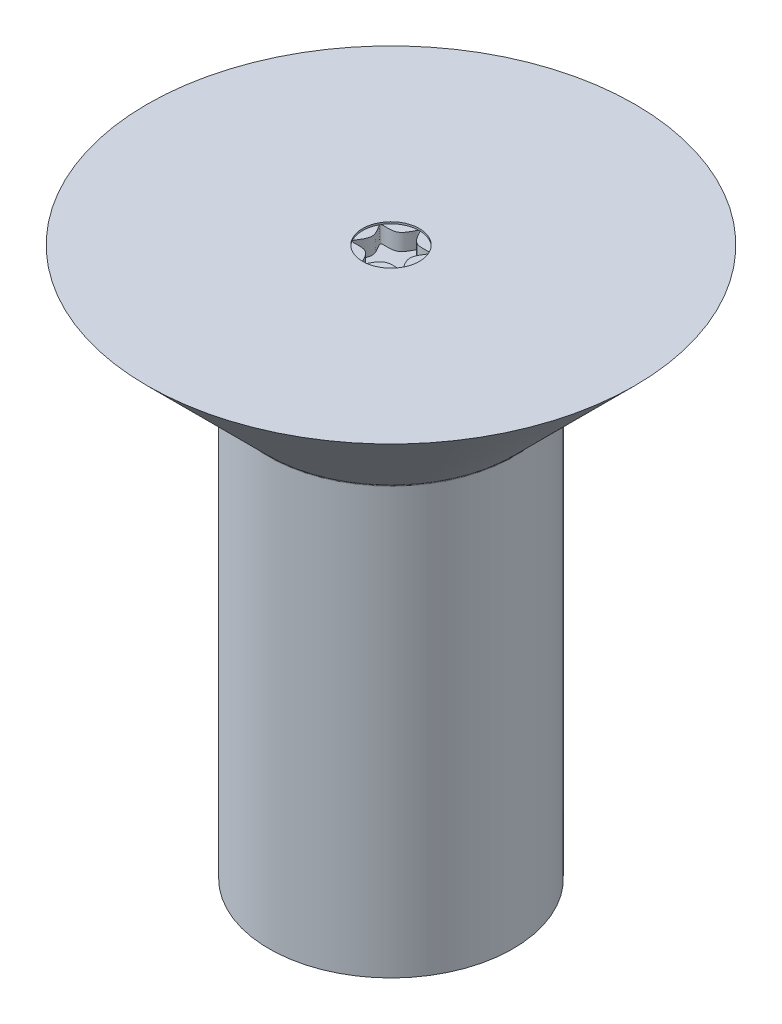
ISO-10303-21;
HEADER;
FILE_DESCRIPTION(('STEP AP214'),'2;1');
FILE_NAME('part.step','',(''),(''),'','','');
FILE_SCHEMA(('AUTOMOTIVE_DESIGN { 1 0 10303 214 1 1 1 1 }'));
ENDSEC;
DATA;
#1=APPLICATION_CONTEXT('core data for automotive mechanical design processes');
#2=APPLICATION_PROTOCOL_DEFINITION('international standard','automotive_design',2000,#1);
#3=PRODUCT_CONTEXT('',#1,'mechanical');
#4=PRODUCT('Part','Part','',(#3));
#5=PRODUCT_RELATED_PRODUCT_CATEGORY('part','',(#4));
#6=PRODUCT_DEFINITION_FORMATION('','',#4);
#7=PRODUCT_DEFINITION_CONTEXT('part definition',#1,'design');
#8=PRODUCT_DEFINITION('design','',#6,#7);
#9=PRODUCT_DEFINITION_SHAPE('','',#8);
#10=(LENGTH_UNIT() NAMED_UNIT(*) SI_UNIT(.MILLI.,.METRE.));
#11=(NAMED_UNIT(*) PLANE_ANGLE_UNIT() SI_UNIT($,.RADIAN.));
#12=(NAMED_UNIT(*) SI_UNIT($,.STERADIAN.) SOLID_ANGLE_UNIT());
#13=UNCERTAINTY_MEASURE_WITH_UNIT(LENGTH_MEASURE(1.E-05),#10,'distance_accuracy_value','');
#14=(GEOMETRIC_REPRESENTATION_CONTEXT(3) GLOBAL_UNCERTAINTY_ASSIGNED_CONTEXT((#13)) GLOBAL_UNIT_ASSIGNED_CONTEXT((#10,
#11,#12)) REPRESENTATION_CONTEXT('',''));
#15=CARTESIAN_POINT('',(0.,0.,0.));
#16=DIRECTION('',(0.,0.,1.));
#17=DIRECTION('',(1.,0.,0.));
#18=AXIS2_PLACEMENT_3D('',#15,#16,#17);
#19=CARTESIAN_POINT('',(0.,27.,0.));
#20=DIRECTION('',(0.,1.,0.));
#21=DIRECTION('',(0.,0.,1.));
#22=AXIS2_PLACEMENT_3D('',#19,#20,#21);
#23=PLANE('',#22);
#24=CARTESIAN_POINT('',(0.,27.,0.));
#25=DIRECTION('',(0.,1.,0.));
#26=DIRECTION('',(0.,0.,1.));
#27=AXIS2_PLACEMENT_3D('',#24,#25,#26);
#28=CIRCLE('',#27,1.4);
#29=CARTESIAN_POINT('',(0.,27.,1.4));
#30=VERTEX_POINT('',#29);
#31=EDGE_CURVE('E94',#30,#30,#28,.T.);
#32=ORIENTED_EDGE('',*,*,#31,.F.);
#33=EDGE_LOOP('',(#32));
#34=FACE_BOUND('',#33,.T.);
#35=CARTESIAN_POINT('',(0.,27.,0.));
#36=DIRECTION('',(0.,-1.,0.));
#37=DIRECTION('',(0.,0.,-1.));
#38=AXIS2_PLACEMENT_3D('',#35,#36,#37);
#39=CIRCLE('',#38,12.);
#40=CARTESIAN_POINT('',(0.,27.,-12.));
#41=VERTEX_POINT('',#40);
#42=EDGE_CURVE('E111',#41,#41,#39,.T.);
#43=ORIENTED_EDGE('',*,*,#42,.F.);
#44=EDGE_LOOP('',(#43));
#45=FACE_BOUND('',#44,.T.);
#46=ADVANCED_FACE('F44',(#34,#45),#23,.T.);
#47=CARTESIAN_POINT('',(0.,21.,0.));
#48=DIRECTION('',(0.,1.,0.));
#49=DIRECTION('',(0.,0.,1.));
#50=AXIS2_PLACEMENT_3D('',#47,#48,#49);
#51=CONICAL_SURFACE('',#50,5.99999999999994,0.785398163397453);
#52=CARTESIAN_POINT('',(0.,21.0292893218813,0.));
#53=DIRECTION('',(0.,1.,0.));
#54=DIRECTION('',(0.,0.,1.));
#55=AXIS2_PLACEMENT_3D('',#52,#53,#54);
#56=CIRCLE('',#55,6.02928932188128);
#57=CARTESIAN_POINT('',(0.,21.0292893218813,6.02928932188128));
#58=VERTEX_POINT('',#57);
#59=EDGE_CURVE('E11',#58,#58,#56,.T.);
#60=ORIENTED_EDGE('',*,*,#59,.T.);
#61=EDGE_LOOP('',(#60));
#62=FACE_BOUND('',#61,.T.);
#63=ORIENTED_EDGE('',*,*,#42,.T.);
#64=EDGE_LOOP('',(#63));
#65=FACE_BOUND('',#64,.T.);
#66=ADVANCED_FACE('F152',(#62,#65),#51,.T.);
#67=CARTESIAN_POINT('',(0.,0.,0.));
#68=DIRECTION('',(0.,-1.,0.));
#69=DIRECTION('',(0.,0.,-1.));
#70=AXIS2_PLACEMENT_3D('',#67,#68,#69);
#71=CYLINDRICAL_SURFACE('',#70,5.99999999999994);
#72=CARTESIAN_POINT('',(0.,20.9585786437627,0.));
#73=DIRECTION('',(0.,-1.,0.));
#74=DIRECTION('',(0.,0.,-1.));
#75=AXIS2_PLACEMENT_3D('',#72,#73,#74);
#76=CIRCLE('',#75,5.99999999999994);
#77=CARTESIAN_POINT('',(0.,20.9585786437627,-5.99999999999994));
#78=VERTEX_POINT('',#77);
#79=EDGE_CURVE('E52',#78,#78,#76,.T.);
#80=ORIENTED_EDGE('',*,*,#79,.T.);
#81=EDGE_LOOP('',(#80));
#82=FACE_BOUND('',#81,.T.);
#83=CARTESIAN_POINT('',(0.,0.,0.));
#84=DIRECTION('',(0.,-1.,0.));
#85=DIRECTION('',(0.,0.,-1.));
#86=AXIS2_PLACEMENT_3D('',#83,#84,#85);
#87=CIRCLE('',#86,5.99999999999994);
#88=CARTESIAN_POINT('',(0.,0.,-5.99999999999994));
#89=VERTEX_POINT('',#88);
#90=EDGE_CURVE('E134',#89,#89,#87,.T.);
#91=ORIENTED_EDGE('',*,*,#90,.F.);
#92=EDGE_LOOP('',(#91));
#93=FACE_BOUND('',#92,.T.);
#94=ADVANCED_FACE('F148',(#82,#93),#71,.T.);
#95=CARTESIAN_POINT('',(5.99999999999994,0.,0.));
#96=DIRECTION('',(0.,-1.,0.));
#97=DIRECTION('',(0.,0.,-1.));
#98=AXIS2_PLACEMENT_3D('',#95,#96,#97);
#99=PLANE('',#98);
#100=ORIENTED_EDGE('',*,*,#90,.T.);
#101=EDGE_LOOP('',(#100));
#102=FACE_BOUND('',#101,.T.);
#103=ADVANCED_FACE('F145',(#102),#99,.T.);
#104=CARTESIAN_POINT('',(0.,26.909,0.));
#105=DIRECTION('',(0.,1.,0.));
#106=DIRECTION('',(0.,0.,1.));
#107=AXIS2_PLACEMENT_3D('',#104,#105,#106);
#108=CYLINDRICAL_SURFACE('',#107,1.4);
#109=ORIENTED_EDGE('',*,*,#31,.T.);
#110=EDGE_LOOP('',(#109));
#111=FACE_BOUND('',#110,.T.);
#112=CARTESIAN_POINT('',(0.,26.909,0.));
#113=DIRECTION('',(0.,1.,0.));
#114=DIRECTION('',(0.,0.,1.));
#115=AXIS2_PLACEMENT_3D('',#112,#113,#114);
#116=CIRCLE('',#115,1.4);
#117=CARTESIAN_POINT('',(1.21243556529821,26.909,0.699999999999999));
#118=VERTEX_POINT('',#117);
#119=CARTESIAN_POINT('',(1.21243556529821,26.909,-0.7));
#120=VERTEX_POINT('',#119);
#121=EDGE_CURVE('E99',#118,#120,#116,.T.);
#122=ORIENTED_EDGE('',*,*,#121,.F.);
#123=CARTESIAN_POINT('',(0.,26.909,1.4));
#124=VERTEX_POINT('',#123);
#125=EDGE_CURVE('E83',#124,#118,#116,.T.);
#126=ORIENTED_EDGE('',*,*,#125,.F.);
#127=CARTESIAN_POINT('',(-1.21243556529821,26.909,0.7));
#128=VERTEX_POINT('',#127);
#129=EDGE_CURVE('E88',#128,#124,#116,.T.);
#130=ORIENTED_EDGE('',*,*,#129,.F.);
#131=CARTESIAN_POINT('',(-1.21243556529821,26.909,-0.7));
#132=VERTEX_POINT('',#131);
#133=EDGE_CURVE('E93',#132,#128,#116,.T.);
#134=ORIENTED_EDGE('',*,*,#133,.F.);
#135=CARTESIAN_POINT('',(0.,26.909,-1.4));
#136=VERTEX_POINT('',#135);
#137=EDGE_CURVE('E123',#136,#132,#116,.T.);
#138=ORIENTED_EDGE('',*,*,#137,.F.);
#139=EDGE_CURVE('E58',#120,#136,#116,.T.);
#140=ORIENTED_EDGE('',*,*,#139,.F.);
#141=EDGE_LOOP('',(#122,#126,#130,#134,#138,#140));
#142=FACE_BOUND('',#141,.T.);
#143=ADVANCED_FACE('F97',(#111,#142),#108,.F.);
#144=CARTESIAN_POINT('',(0.,26.909,0.));
#145=DIRECTION('',(0.,1.,0.));
#146=DIRECTION('',(0.,0.,1.));
#147=AXIS2_PLACEMENT_3D('',#144,#145,#146);
#148=PLANE('',#147);
#149=ORIENTED_EDGE('',*,*,#137,.T.);
#150=CARTESIAN_POINT('',(0.,26.909,-1.4));
#151=CARTESIAN_POINT('',(0.100650938672069,26.909,-1.4));
#152=CARTESIAN_POINT('',(0.301952816016209,26.909,-0.522997618828571));
#153=CARTESIAN_POINT('',(1.59218873593516,26.909,-0.919250595292857));
#154=CARTESIAN_POINT('',(0.603905632032418,26.909,0.));
#155=CARTESIAN_POINT('',(1.59218873593516,26.909,0.919250595292857));
#156=CARTESIAN_POINT('',(0.301952816016209,26.909,0.52299761882857));
#157=CARTESIAN_POINT('',(0.,26.909,1.83850119058571));
#158=CARTESIAN_POINT('',(-0.301952816016207,26.909,0.522997618828569));
#159=CARTESIAN_POINT('',(-1.59218873593516,26.909,0.919250595292859));
#160=CARTESIAN_POINT('',(-0.603905632032417,26.909,0.));
#161=CARTESIAN_POINT('',(-1.59218873593517,26.909,-0.919250595292858));
#162=CARTESIAN_POINT('',(-0.301952816016207,26.909,-0.52299761882857));
#163=CARTESIAN_POINT('',(-0.100650938672069,26.909,-1.4));
#164=CARTESIAN_POINT('',(0.,26.909,-1.4));
#165=B_SPLINE_CURVE_WITH_KNOTS('',3,(#150,#151,#152,#153,#154,#155,#156,#157,#158,#159,#160,
#161,#162,#163,#164),.UNSPECIFIED.,.T.,.F.,(4,1,1,1,1,1,1,1,1,1,1,1,4),(0.,0.0833333333333334,
0.166666666666667,0.25,0.333333333333333,0.416666666666667,0.5,0.583333333333333,
0.666666666666667,0.75,0.833333333333333,0.916666666666667,1.),.UNSPECIFIED.);
#166=EDGE_CURVE('E106',#136,#132,#165,.F.);
#167=ORIENTED_EDGE('',*,*,#166,.F.);
#168=EDGE_LOOP('',(#149,#167));
#169=FACE_BOUND('',#168,.T.);
#170=ADVANCED_FACE('F122',(#169),#148,.T.);
#171=ORIENTED_EDGE('',*,*,#133,.T.);
#172=EDGE_CURVE('E105',#132,#128,#165,.F.);
#173=ORIENTED_EDGE('',*,*,#172,.F.);
#174=EDGE_LOOP('',(#171,#173));
#175=FACE_BOUND('',#174,.T.);
#176=ADVANCED_FACE('F173',(#175),#148,.T.);
#177=ORIENTED_EDGE('',*,*,#129,.T.);
#178=EDGE_CURVE('E65',#128,#124,#165,.F.);
#179=ORIENTED_EDGE('',*,*,#178,.F.);
#180=EDGE_LOOP('',(#177,#179));
#181=FACE_BOUND('',#180,.T.);
#182=ADVANCED_FACE('F89',(#181),#148,.T.);
#183=ORIENTED_EDGE('',*,*,#125,.T.);
#184=EDGE_CURVE('E80',#124,#118,#165,.F.);
#185=ORIENTED_EDGE('',*,*,#184,.F.);
#186=EDGE_LOOP('',(#183,#185));
#187=FACE_BOUND('',#186,.T.);
#188=ADVANCED_FACE('F81',(#187),#148,.T.);
#189=ORIENTED_EDGE('',*,*,#121,.T.);
#190=EDGE_CURVE('E86',#118,#120,#165,.F.);
#191=ORIENTED_EDGE('',*,*,#190,.F.);
#192=EDGE_LOOP('',(#189,#191));
#193=FACE_BOUND('',#192,.T.);
#194=ADVANCED_FACE('F178',(#193),#148,.T.);
#195=ORIENTED_EDGE('',*,*,#139,.T.);
#196=EDGE_CURVE('E107',#120,#136,#165,.F.);
#197=ORIENTED_EDGE('',*,*,#196,.F.);
#198=EDGE_LOOP('',(#195,#197));
#199=FACE_BOUND('',#198,.T.);
#200=ADVANCED_FACE('F175',(#199),#148,.T.);
#201=CARTESIAN_POINT('',(0.,26.09,1.4));
#202=DIRECTION('',(0.,1.,0.));
#203=DIRECTION('',(0.,0.,1.));
#204=AXIS2_PLACEMENT_3D('',#201,#202,#203);
#205=PLANE('',#204);
#206=CARTESIAN_POINT('',(0.,26.09,-1.4));
#207=CARTESIAN_POINT('',(0.100650938672069,26.09,-1.4));
#208=CARTESIAN_POINT('',(0.301952816016209,26.09,-0.522997618828571));
#209=CARTESIAN_POINT('',(1.59218873593516,26.09,-0.919250595292857));
#210=CARTESIAN_POINT('',(0.603905632032418,26.09,0.));
#211=CARTESIAN_POINT('',(1.59218873593516,26.09,0.919250595292857));
#212=CARTESIAN_POINT('',(0.301952816016209,26.09,0.52299761882857));
#213=CARTESIAN_POINT('',(0.,26.09,1.83850119058571));
#214=CARTESIAN_POINT('',(-0.301952816016207,26.09,0.522997618828569));
#215=CARTESIAN_POINT('',(-1.59218873593516,26.09,0.919250595292859));
#216=CARTESIAN_POINT('',(-0.603905632032417,26.09,0.));
#217=CARTESIAN_POINT('',(-1.59218873593517,26.09,-0.919250595292858));
#218=CARTESIAN_POINT('',(-0.301952816016207,26.09,-0.52299761882857));
#219=CARTESIAN_POINT('',(-0.100650938672069,26.09,-1.4));
#220=CARTESIAN_POINT('',(0.,26.09,-1.4));
#221=B_SPLINE_CURVE_WITH_KNOTS('',3,(#206,#207,#208,#209,#210,#211,#212,#213,#214,#215,#216,
#217,#218,#219,#220),.UNSPECIFIED.,.T.,.F.,(4,1,1,1,1,1,1,1,1,1,1,1,4),(0.,0.0833333333333334,
0.166666666666667,0.25,0.333333333333333,0.416666666666667,0.5,0.583333333333333,
0.666666666666667,0.75,0.833333333333333,0.916666666666667,1.),.UNSPECIFIED.);
#222=CARTESIAN_POINT('',(0.,26.09,-1.4));
#223=VERTEX_POINT('',#222);
#224=EDGE_CURVE('E100',#223,#223,#221,.T.);
#225=ORIENTED_EDGE('',*,*,#224,.F.);
#226=EDGE_LOOP('',(#225));
#227=FACE_BOUND('',#226,.T.);
#228=ADVANCED_FACE('F142',(#227),#205,.T.);
#229=DIRECTION('',(0.,1.,0.));
#230=VECTOR('',#229,1.);
#231=SURFACE_OF_LINEAR_EXTRUSION('',#221,#230);
#232=ORIENTED_EDGE('',*,*,#224,.T.);
#233=EDGE_LOOP('',(#232));
#234=FACE_BOUND('',#233,.T.);
#235=ORIENTED_EDGE('',*,*,#196,.T.);
#236=ORIENTED_EDGE('',*,*,#166,.T.);
#237=ORIENTED_EDGE('',*,*,#172,.T.);
#238=ORIENTED_EDGE('',*,*,#178,.T.);
#239=ORIENTED_EDGE('',*,*,#184,.T.);
#240=ORIENTED_EDGE('',*,*,#190,.T.);
#241=EDGE_LOOP('',(#235,#236,#237,#238,#239,#240));
#242=FACE_BOUND('',#241,.T.);
#243=ADVANCED_FACE('F103',(#234,#242),#231,.T.);
#244=CARTESIAN_POINT('',(0.,20.9585786437627,0.));
#245=DIRECTION('',(0.,-1.,0.));
#246=DIRECTION('',(0.,0.,-1.));
#247=AXIS2_PLACEMENT_3D('',#244,#245,#246);
#248=TOROIDAL_SURFACE('',#247,6.09999999999994,0.1);
#249=ORIENTED_EDGE('',*,*,#59,.F.);
#250=EDGE_LOOP('',(#249));
#251=FACE_BOUND('',#250,.T.);
#252=ORIENTED_EDGE('',*,*,#79,.F.);
#253=EDGE_LOOP('',(#252));
#254=FACE_BOUND('',#253,.T.);
#255=ADVANCED_FACE('F46',(#251,#254),#248,.F.);
#256=CLOSED_SHELL('',(#46,#66,#94,#103,#143,#170,#176,#182,#188,#194,#200,#228,#243,#255));
#257=CARTESIAN_POINT('',(0.,0.,0.));
#258=DIRECTION('',(0.,-1.,0.));
#259=DIRECTION('',(0.,0.,-1.));
#260=AXIS2_PLACEMENT_3D('',#257,#258,#259);
#261=CYLINDRICAL_SURFACE('',#260,4.79994809042723);
#262=CARTESIAN_POINT('',(0.,21.6,0.));
#263=DIRECTION('',(0.,-1.,0.));
#264=DIRECTION('',(0.,0.,-1.));
#265=AXIS2_PLACEMENT_3D('',#262,#263,#264);
#266=CIRCLE('',#265,4.79994809042723);
#267=CARTESIAN_POINT('',(0.,21.6,-4.79994809042723));
#268=VERTEX_POINT('',#267);
#269=EDGE_CURVE('E200',#268,#268,#266,.T.);
#270=ORIENTED_EDGE('',*,*,#269,.F.);
#271=EDGE_LOOP('',(#270));
#272=FACE_BOUND('',#271,.T.);
#273=CARTESIAN_POINT('',(0.,26.09,0.));
#274=DIRECTION('',(0.,-1.,0.));
#275=DIRECTION('',(0.,0.,-1.));
#276=AXIS2_PLACEMENT_3D('',#273,#274,#275);
#277=CIRCLE('',#276,4.79994809042723);
#278=CARTESIAN_POINT('',(0.,26.09,-4.79994809042723));
#279=VERTEX_POINT('',#278);
#280=EDGE_CURVE('E126',#279,#279,#277,.T.);
#281=ORIENTED_EDGE('',*,*,#280,.T.);
#282=EDGE_LOOP('',(#281));
#283=FACE_BOUND('',#282,.T.);
#284=ADVANCED_FACE('F179',(#272,#283),#261,.T.);
#285=CARTESIAN_POINT('',(4.79994809042723,26.09,0.));
#286=DIRECTION('',(0.,1.,0.));
#287=DIRECTION('',(0.,0.,1.));
#288=AXIS2_PLACEMENT_3D('',#285,#286,#287);
#289=PLANE('',#288);
#290=ORIENTED_EDGE('',*,*,#280,.F.);
#291=EDGE_LOOP('',(#290));
#292=FACE_BOUND('',#291,.T.);
#293=CARTESIAN_POINT('',(0.,26.09,0.));
#294=DIRECTION('',(0.,-1.,0.));
#295=DIRECTION('',(0.,0.,-1.));
#296=AXIS2_PLACEMENT_3D('',#293,#294,#295);
#297=CIRCLE('',#296,5.73328142376073);
#298=CARTESIAN_POINT('',(0.,26.09,-5.73328142376073));
#299=VERTEX_POINT('',#298);
#300=EDGE_CURVE('E197',#299,#299,#297,.T.);
#301=ORIENTED_EDGE('',*,*,#300,.T.);
#302=EDGE_LOOP('',(#301));
#303=FACE_BOUND('',#302,.T.);
#304=ADVANCED_FACE('F182',(#292,#303),#289,.F.);
#305=CARTESIAN_POINT('',(0.,21.6,0.));
#306=DIRECTION('',(0.,1.,0.));
#307=DIRECTION('',(0.,0.,1.));
#308=AXIS2_PLACEMENT_3D('',#305,#306,#307);
#309=CONICAL_SURFACE('',#308,4.79994809042723,0.204950654873773);
#310=ORIENTED_EDGE('',*,*,#300,.F.);
#311=EDGE_LOOP('',(#310));
#312=FACE_BOUND('',#311,.T.);
#313=ORIENTED_EDGE('',*,*,#269,.T.);
#314=EDGE_LOOP('',(#313));
#315=FACE_BOUND('',#314,.T.);
#316=ADVANCED_FACE('F187',(#312,#315),#309,.F.);
#317=CLOSED_SHELL('',(#284,#304,#316));
#318=ORIENTED_CLOSED_SHELL('',*,#317,.T.);
#319=BREP_WITH_VOIDS('B2',#256,(#318));
#320=ADVANCED_BREP_SHAPE_REPRESENTATION('',(#18,#319),#14);
#321=SHAPE_DEFINITION_REPRESENTATION(#9,#320);
ENDSEC;
END-ISO-10303-21;
